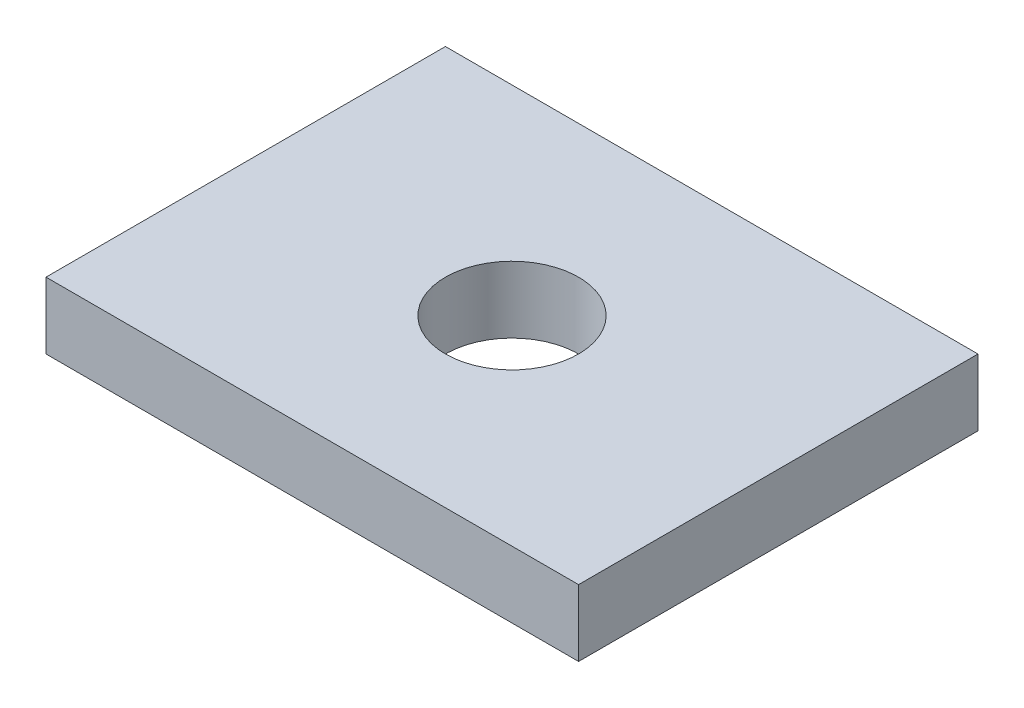
ISO-10303-21;
HEADER;
FILE_DESCRIPTION(('STEP AP214'),'2;1');
FILE_NAME('part.step','',(''),(''),'','','');
FILE_SCHEMA(('AUTOMOTIVE_DESIGN { 1 0 10303 214 1 1 1 1 }'));
ENDSEC;
DATA;
#1=APPLICATION_CONTEXT('core data for automotive mechanical design processes');
#2=APPLICATION_PROTOCOL_DEFINITION('international standard','automotive_design',2000,#1);
#3=PRODUCT_CONTEXT('',#1,'mechanical');
#4=PRODUCT('Part','Part','',(#3));
#5=PRODUCT_RELATED_PRODUCT_CATEGORY('part','',(#4));
#6=PRODUCT_DEFINITION_FORMATION('','',#4);
#7=PRODUCT_DEFINITION_CONTEXT('part definition',#1,'design');
#8=PRODUCT_DEFINITION('design','',#6,#7);
#9=PRODUCT_DEFINITION_SHAPE('','',#8);
#10=(LENGTH_UNIT() NAMED_UNIT(*) SI_UNIT(.MILLI.,.METRE.));
#11=(NAMED_UNIT(*) PLANE_ANGLE_UNIT() SI_UNIT($,.RADIAN.));
#12=(NAMED_UNIT(*) SI_UNIT($,.STERADIAN.) SOLID_ANGLE_UNIT());
#13=UNCERTAINTY_MEASURE_WITH_UNIT(LENGTH_MEASURE(1.E-05),#10,'distance_accuracy_value','');
#14=(GEOMETRIC_REPRESENTATION_CONTEXT(3) GLOBAL_UNCERTAINTY_ASSIGNED_CONTEXT((#13)) GLOBAL_UNIT_ASSIGNED_CONTEXT((#10,
#11,#12)) REPRESENTATION_CONTEXT('',''));
#15=CARTESIAN_POINT('',(0.,0.,0.));
#16=DIRECTION('',(0.,0.,1.));
#17=DIRECTION('',(1.,0.,0.));
#18=AXIS2_PLACEMENT_3D('',#15,#16,#17);
#19=CARTESIAN_POINT('',(0.,10.,0.));
#20=DIRECTION('',(0.,1.,0.));
#21=DIRECTION('',(0.,0.,1.));
#22=AXIS2_PLACEMENT_3D('',#19,#20,#21);
#23=PLANE('',#22);
#24=DIRECTION('',(0.,0.,-1.));
#25=VECTOR('',#24,1.);
#26=CARTESIAN_POINT('',(40.,10.,-30.));
#27=LINE('',#26,#25);
#28=CARTESIAN_POINT('',(40.,10.,30.));
#29=VERTEX_POINT('',#28);
#30=CARTESIAN_POINT('',(40.,10.,-30.));
#31=VERTEX_POINT('',#30);
#32=EDGE_CURVE('E91',#29,#31,#27,.T.);
#33=ORIENTED_EDGE('',*,*,#32,.T.);
#34=DIRECTION('',(-1.,0.,0.));
#35=VECTOR('',#34,1.);
#36=CARTESIAN_POINT('',(-40.,10.,-30.));
#37=LINE('',#36,#35);
#38=CARTESIAN_POINT('',(-40.,10.,-30.));
#39=VERTEX_POINT('',#38);
#40=EDGE_CURVE('E86',#31,#39,#37,.T.);
#41=ORIENTED_EDGE('',*,*,#40,.T.);
#42=DIRECTION('',(0.,0.,1.));
#43=VECTOR('',#42,1.);
#44=CARTESIAN_POINT('',(-40.,10.,-30.));
#45=LINE('',#44,#43);
#46=CARTESIAN_POINT('',(-40.,10.,30.));
#47=VERTEX_POINT('',#46);
#48=EDGE_CURVE('E87',#39,#47,#45,.T.);
#49=ORIENTED_EDGE('',*,*,#48,.T.);
#50=DIRECTION('',(1.,0.,0.));
#51=VECTOR('',#50,1.);
#52=CARTESIAN_POINT('',(-40.,10.,30.));
#53=LINE('',#52,#51);
#54=EDGE_CURVE('E57',#47,#29,#53,.T.);
#55=ORIENTED_EDGE('',*,*,#54,.T.);
#56=EDGE_LOOP('',(#33,#41,#49,#55));
#57=FACE_BOUND('',#56,.T.);
#58=CARTESIAN_POINT('',(0.,10.,0.));
#59=DIRECTION('',(0.,1.,0.));
#60=DIRECTION('',(0.,0.,1.));
#61=AXIS2_PLACEMENT_3D('',#58,#59,#60);
#62=CIRCLE('',#61,10.);
#63=CARTESIAN_POINT('',(0.,10.,10.));
#64=VERTEX_POINT('',#63);
#65=EDGE_CURVE('E107',#64,#64,#62,.T.);
#66=ORIENTED_EDGE('',*,*,#65,.F.);
#67=EDGE_LOOP('',(#66));
#68=FACE_BOUND('',#67,.T.);
#69=ADVANCED_FACE('F39',(#57,#68),#23,.T.);
#70=CARTESIAN_POINT('',(0.,0.,0.));
#71=DIRECTION('',(0.,1.,0.));
#72=DIRECTION('',(0.,0.,1.));
#73=AXIS2_PLACEMENT_3D('',#70,#71,#72);
#74=PLANE('',#73);
#75=DIRECTION('',(0.,0.,-1.));
#76=VECTOR('',#75,1.);
#77=CARTESIAN_POINT('',(40.,0.,-30.));
#78=LINE('',#77,#76);
#79=CARTESIAN_POINT('',(40.,0.,30.));
#80=VERTEX_POINT('',#79);
#81=CARTESIAN_POINT('',(40.,0.,-30.));
#82=VERTEX_POINT('',#81);
#83=EDGE_CURVE('E104',#80,#82,#78,.T.);
#84=ORIENTED_EDGE('',*,*,#83,.F.);
#85=DIRECTION('',(1.,0.,0.));
#86=VECTOR('',#85,1.);
#87=CARTESIAN_POINT('',(-40.,0.,30.));
#88=LINE('',#87,#86);
#89=CARTESIAN_POINT('',(-40.,0.,30.));
#90=VERTEX_POINT('',#89);
#91=EDGE_CURVE('E80',#90,#80,#88,.T.);
#92=ORIENTED_EDGE('',*,*,#91,.F.);
#93=DIRECTION('',(0.,0.,1.));
#94=VECTOR('',#93,1.);
#95=CARTESIAN_POINT('',(-40.,0.,-30.));
#96=LINE('',#95,#94);
#97=CARTESIAN_POINT('',(-40.,0.,-30.));
#98=VERTEX_POINT('',#97);
#99=EDGE_CURVE('E75',#98,#90,#96,.T.);
#100=ORIENTED_EDGE('',*,*,#99,.F.);
#101=DIRECTION('',(-1.,0.,0.));
#102=VECTOR('',#101,1.);
#103=CARTESIAN_POINT('',(-40.,0.,-30.));
#104=LINE('',#103,#102);
#105=EDGE_CURVE('E94',#82,#98,#104,.T.);
#106=ORIENTED_EDGE('',*,*,#105,.F.);
#107=EDGE_LOOP('',(#84,#92,#100,#106));
#108=FACE_BOUND('',#107,.T.);
#109=CARTESIAN_POINT('',(0.,0.,0.));
#110=DIRECTION('',(0.,1.,0.));
#111=DIRECTION('',(0.,0.,1.));
#112=AXIS2_PLACEMENT_3D('',#109,#110,#111);
#113=CIRCLE('',#112,10.);
#114=CARTESIAN_POINT('',(0.,0.,10.));
#115=VERTEX_POINT('',#114);
#116=EDGE_CURVE('E120',#115,#115,#113,.T.);
#117=ORIENTED_EDGE('',*,*,#116,.T.);
#118=EDGE_LOOP('',(#117));
#119=FACE_BOUND('',#118,.T.);
#120=ADVANCED_FACE('F114',(#108,#119),#74,.F.);
#121=CARTESIAN_POINT('',(40.,10.,-30.));
#122=DIRECTION('',(-1.,0.,0.));
#123=DIRECTION('',(0.,0.,1.));
#124=AXIS2_PLACEMENT_3D('',#121,#122,#123);
#125=PLANE('',#124);
#126=ORIENTED_EDGE('',*,*,#83,.T.);
#127=DIRECTION('',(0.,-1.,0.));
#128=VECTOR('',#127,1.);
#129=CARTESIAN_POINT('',(40.,10.,-30.));
#130=LINE('',#129,#128);
#131=EDGE_CURVE('E11',#31,#82,#130,.T.);
#132=ORIENTED_EDGE('',*,*,#131,.F.);
#133=ORIENTED_EDGE('',*,*,#32,.F.);
#134=DIRECTION('',(0.,-1.,0.));
#135=VECTOR('',#134,1.);
#136=CARTESIAN_POINT('',(40.,10.,30.));
#137=LINE('',#136,#135);
#138=EDGE_CURVE('E98',#29,#80,#137,.T.);
#139=ORIENTED_EDGE('',*,*,#138,.T.);
#140=EDGE_LOOP('',(#126,#132,#133,#139));
#141=FACE_BOUND('',#140,.T.);
#142=ADVANCED_FACE('F41',(#141),#125,.F.);
#143=CARTESIAN_POINT('',(-40.,10.,-30.));
#144=DIRECTION('',(0.,0.,1.));
#145=DIRECTION('',(1.,0.,0.));
#146=AXIS2_PLACEMENT_3D('',#143,#144,#145);
#147=PLANE('',#146);
#148=ORIENTED_EDGE('',*,*,#105,.T.);
#149=DIRECTION('',(0.,-1.,0.));
#150=VECTOR('',#149,1.);
#151=CARTESIAN_POINT('',(-40.,10.,-30.));
#152=LINE('',#151,#150);
#153=EDGE_CURVE('E48',#39,#98,#152,.T.);
#154=ORIENTED_EDGE('',*,*,#153,.F.);
#155=ORIENTED_EDGE('',*,*,#40,.F.);
#156=ORIENTED_EDGE('',*,*,#131,.T.);
#157=EDGE_LOOP('',(#148,#154,#155,#156));
#158=FACE_BOUND('',#157,.T.);
#159=ADVANCED_FACE('F92',(#158),#147,.F.);
#160=CARTESIAN_POINT('',(-40.,10.,-30.));
#161=DIRECTION('',(1.,0.,0.));
#162=DIRECTION('',(0.,0.,-1.));
#163=AXIS2_PLACEMENT_3D('',#160,#161,#162);
#164=PLANE('',#163);
#165=ORIENTED_EDGE('',*,*,#99,.T.);
#166=DIRECTION('',(0.,-1.,0.));
#167=VECTOR('',#166,1.);
#168=CARTESIAN_POINT('',(-40.,10.,30.));
#169=LINE('',#168,#167);
#170=EDGE_CURVE('E96',#47,#90,#169,.T.);
#171=ORIENTED_EDGE('',*,*,#170,.F.);
#172=ORIENTED_EDGE('',*,*,#48,.F.);
#173=ORIENTED_EDGE('',*,*,#153,.T.);
#174=EDGE_LOOP('',(#165,#171,#172,#173));
#175=FACE_BOUND('',#174,.T.);
#176=ADVANCED_FACE('F100',(#175),#164,.F.);
#177=CARTESIAN_POINT('',(-40.,10.,30.));
#178=DIRECTION('',(0.,0.,-1.));
#179=DIRECTION('',(-1.,0.,0.));
#180=AXIS2_PLACEMENT_3D('',#177,#178,#179);
#181=PLANE('',#180);
#182=ORIENTED_EDGE('',*,*,#91,.T.);
#183=ORIENTED_EDGE('',*,*,#138,.F.);
#184=ORIENTED_EDGE('',*,*,#54,.F.);
#185=ORIENTED_EDGE('',*,*,#170,.T.);
#186=EDGE_LOOP('',(#182,#183,#184,#185));
#187=FACE_BOUND('',#186,.T.);
#188=ADVANCED_FACE('F112',(#187),#181,.F.);
#189=CARTESIAN_POINT('',(0.,10.,0.));
#190=DIRECTION('',(0.,-1.,0.));
#191=DIRECTION('',(0.,0.,-1.));
#192=AXIS2_PLACEMENT_3D('',#189,#190,#191);
#193=CYLINDRICAL_SURFACE('',#192,10.);
#194=ORIENTED_EDGE('',*,*,#65,.T.);
#195=EDGE_LOOP('',(#194));
#196=FACE_BOUND('',#195,.T.);
#197=ORIENTED_EDGE('',*,*,#116,.F.);
#198=EDGE_LOOP('',(#197));
#199=FACE_BOUND('',#198,.T.);
#200=ADVANCED_FACE('F125',(#196,#199),#193,.F.);
#201=CLOSED_SHELL('',(#69,#120,#142,#159,#176,#188,#200));
#202=MANIFOLD_SOLID_BREP('B2',#201);
#203=ADVANCED_BREP_SHAPE_REPRESENTATION('',(#18,#202),#14);
#204=SHAPE_DEFINITION_REPRESENTATION(#9,#203);
ENDSEC;
END-ISO-10303-21;
